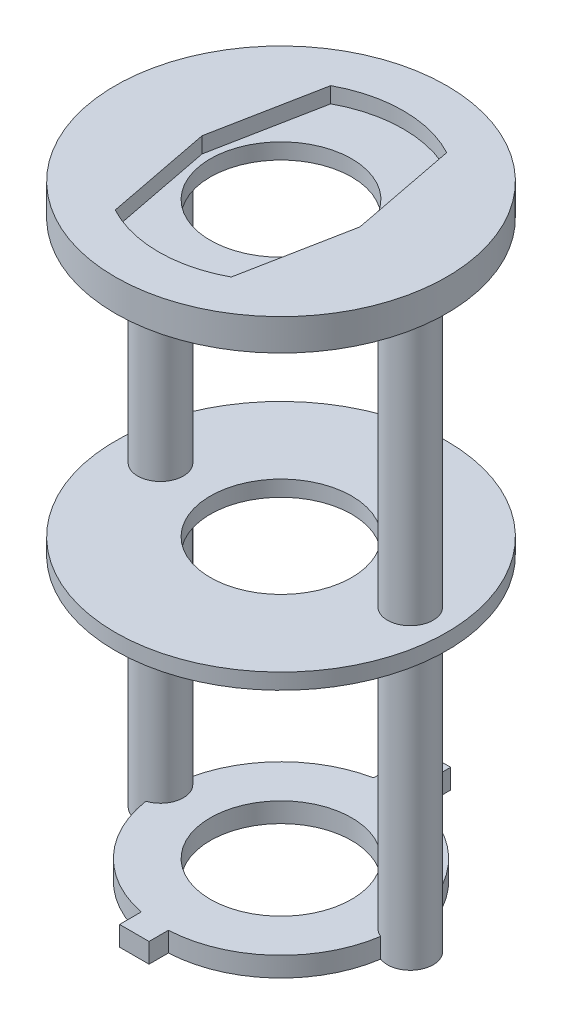
ISO-10303-21;
HEADER;
FILE_DESCRIPTION(('STEP AP214'),'2;1');
FILE_NAME('part.step','',(''),(''),'','','');
FILE_SCHEMA(('AUTOMOTIVE_DESIGN { 1 0 10303 214 1 1 1 1 }'));
ENDSEC;
DATA;
#1=APPLICATION_CONTEXT('core data for automotive mechanical design processes');
#2=APPLICATION_PROTOCOL_DEFINITION('international standard','automotive_design',2000,#1);
#3=PRODUCT_CONTEXT('',#1,'mechanical');
#4=PRODUCT('Part','Part','',(#3));
#5=PRODUCT_RELATED_PRODUCT_CATEGORY('part','',(#4));
#6=PRODUCT_DEFINITION_FORMATION('','',#4);
#7=PRODUCT_DEFINITION_CONTEXT('part definition',#1,'design');
#8=PRODUCT_DEFINITION('design','',#6,#7);
#9=PRODUCT_DEFINITION_SHAPE('','',#8);
#10=(LENGTH_UNIT() NAMED_UNIT(*) SI_UNIT(.MILLI.,.METRE.));
#11=(NAMED_UNIT(*) PLANE_ANGLE_UNIT() SI_UNIT($,.RADIAN.));
#12=(NAMED_UNIT(*) SI_UNIT($,.STERADIAN.) SOLID_ANGLE_UNIT());
#13=UNCERTAINTY_MEASURE_WITH_UNIT(LENGTH_MEASURE(1.E-05),#10,'distance_accuracy_value','');
#14=(GEOMETRIC_REPRESENTATION_CONTEXT(3) GLOBAL_UNCERTAINTY_ASSIGNED_CONTEXT((#13)) GLOBAL_UNIT_ASSIGNED_CONTEXT((#10,
#11,#12)) REPRESENTATION_CONTEXT('',''));
#15=CARTESIAN_POINT('',(0.,0.,0.));
#16=DIRECTION('',(0.,0.,1.));
#17=DIRECTION('',(1.,0.,0.));
#18=AXIS2_PLACEMENT_3D('',#15,#16,#17);
#19=CARTESIAN_POINT('',(15.9072388903172,-2.5,-0.47389161154081));
#20=DIRECTION('',(0.,1.,0.));
#21=DIRECTION('',(0.,0.,1.));
#22=AXIS2_PLACEMENT_3D('',#19,#20,#21);
#23=CYLINDRICAL_SURFACE('',#22,2.89600429274939);
#24=CARTESIAN_POINT('',(15.9072388903172,70.305,-0.47389161154081));
#25=DIRECTION('',(0.,1.,0.));
#26=DIRECTION('',(0.,0.,1.));
#27=AXIS2_PLACEMENT_3D('',#24,#25,#26);
#28=CIRCLE('',#27,2.89600429274939);
#29=CARTESIAN_POINT('',(15.9072388903172,70.305,2.42211268120858));
#30=VERTEX_POINT('',#29);
#31=EDGE_CURVE('E170',#30,#30,#28,.T.);
#32=ORIENTED_EDGE('',*,*,#31,.F.);
#33=EDGE_LOOP('',(#32));
#34=FACE_BOUND('',#33,.T.);
#35=CARTESIAN_POINT('',(15.9072388903172,35.305,-0.47389161154081));
#36=DIRECTION('',(0.,-1.,0.));
#37=DIRECTION('',(0.,0.,-1.));
#38=AXIS2_PLACEMENT_3D('',#35,#36,#37);
#39=CIRCLE('',#38,2.89600429274939);
#40=CARTESIAN_POINT('',(15.9072388903172,35.305,-3.3698959042902));
#41=VERTEX_POINT('',#40);
#42=EDGE_CURVE('E222',#41,#41,#39,.F.);
#43=ORIENTED_EDGE('',*,*,#42,.T.);
#44=EDGE_LOOP('',(#43));
#45=FACE_BOUND('',#44,.T.);
#46=ADVANCED_FACE('F33',(#34,#45),#23,.T.);
#47=CARTESIAN_POINT('',(-15.7409611318818,-2.5,-0.47389161154081));
#48=DIRECTION('',(0.,1.,0.));
#49=DIRECTION('',(0.,0.,1.));
#50=AXIS2_PLACEMENT_3D('',#47,#48,#49);
#51=CYLINDRICAL_SURFACE('',#50,2.89600429274938);
#52=CARTESIAN_POINT('',(-15.7409611318818,70.305,-0.47389161154081));
#53=DIRECTION('',(0.,1.,0.));
#54=DIRECTION('',(0.,0.,1.));
#55=AXIS2_PLACEMENT_3D('',#52,#53,#54);
#56=CIRCLE('',#55,2.89600429274938);
#57=CARTESIAN_POINT('',(-15.7409611318818,70.305,2.42211268120857));
#58=VERTEX_POINT('',#57);
#59=EDGE_CURVE('E295',#58,#58,#56,.T.);
#60=ORIENTED_EDGE('',*,*,#59,.F.);
#61=EDGE_LOOP('',(#60));
#62=FACE_BOUND('',#61,.T.);
#63=CARTESIAN_POINT('',(-15.7409611318818,35.305,-0.47389161154081));
#64=DIRECTION('',(0.,-1.,0.));
#65=DIRECTION('',(0.,0.,-1.));
#66=AXIS2_PLACEMENT_3D('',#63,#64,#65);
#67=CIRCLE('',#66,2.89600429274938);
#68=CARTESIAN_POINT('',(-15.7409611318818,35.305,-3.36989590429019));
#69=VERTEX_POINT('',#68);
#70=EDGE_CURVE('E220',#69,#69,#67,.F.);
#71=ORIENTED_EDGE('',*,*,#70,.T.);
#72=EDGE_LOOP('',(#71));
#73=FACE_BOUND('',#72,.T.);
#74=ADVANCED_FACE('F380',(#62,#73),#51,.T.);
#75=CARTESIAN_POINT('',(0.,74.305,0.));
#76=DIRECTION('',(0.,1.,0.));
#77=DIRECTION('',(0.,0.,1.));
#78=AXIS2_PLACEMENT_3D('',#75,#76,#77);
#79=PLANE('',#78);
#80=CARTESIAN_POINT('',(0.,74.305,0.));
#81=DIRECTION('',(0.,1.,0.));
#82=DIRECTION('',(0.,0.,-1.));
#83=AXIS2_PLACEMENT_3D('',#80,#81,#82);
#84=CIRCLE('',#83,15.5);
#85=CARTESIAN_POINT('',(7.35,74.305,-13.64651970284));
#86=VERTEX_POINT('',#85);
#87=CARTESIAN_POINT('',(-7.35,74.305,-13.64651970284));
#88=VERTEX_POINT('',#87);
#89=EDGE_CURVE('E49',#86,#88,#84,.T.);
#90=ORIENTED_EDGE('',*,*,#89,.F.);
#91=DIRECTION('',(-0.190580912141045,0.,-0.981671490839724));
#92=VECTOR('',#91,1.);
#93=CARTESIAN_POINT('',(10.,74.305,0.00348029716001202));
#94=LINE('',#93,#92);
#95=CARTESIAN_POINT('',(10.,74.305,0.00348029716001202));
#96=VERTEX_POINT('',#95);
#97=EDGE_CURVE('E244',#96,#86,#94,.T.);
#98=ORIENTED_EDGE('',*,*,#97,.F.);
#99=DIRECTION('',(0.190580912141045,0.,-0.981671490839724));
#100=VECTOR('',#99,1.);
#101=CARTESIAN_POINT('',(7.35,74.305,13.65348029716));
#102=LINE('',#101,#100);
#103=CARTESIAN_POINT('',(7.35,74.305,13.65348029716));
#104=VERTEX_POINT('',#103);
#105=EDGE_CURVE('E270',#104,#96,#102,.T.);
#106=ORIENTED_EDGE('',*,*,#105,.F.);
#107=CARTESIAN_POINT('',(0.,74.305,0.00696059432002231));
#108=DIRECTION('',(0.,1.,0.));
#109=DIRECTION('',(0.,0.,1.));
#110=AXIS2_PLACEMENT_3D('',#107,#108,#109);
#111=CIRCLE('',#110,15.5);
#112=CARTESIAN_POINT('',(-7.35,74.305,13.65348029716));
#113=VERTEX_POINT('',#112);
#114=EDGE_CURVE('E267',#113,#104,#111,.T.);
#115=ORIENTED_EDGE('',*,*,#114,.F.);
#116=DIRECTION('',(0.190580912141046,0.,0.981671490839724));
#117=VECTOR('',#116,1.);
#118=CARTESIAN_POINT('',(-10.,74.305,0.00348029716001289));
#119=LINE('',#118,#117);
#120=CARTESIAN_POINT('',(-10.,74.305,0.00348029716001289));
#121=VERTEX_POINT('',#120);
#122=EDGE_CURVE('E264',#121,#113,#119,.T.);
#123=ORIENTED_EDGE('',*,*,#122,.F.);
#124=DIRECTION('',(-0.190580912141046,0.,0.981671490839724));
#125=VECTOR('',#124,1.);
#126=CARTESIAN_POINT('',(-7.35,74.305,-13.64651970284));
#127=LINE('',#126,#125);
#128=EDGE_CURVE('E261',#88,#121,#127,.T.);
#129=ORIENTED_EDGE('',*,*,#128,.F.);
#130=EDGE_LOOP('',(#90,#98,#106,#115,#123,#129));
#131=FACE_BOUND('',#130,.T.);
#132=CARTESIAN_POINT('',(0.,74.305,0.));
#133=DIRECTION('',(0.,1.,0.));
#134=DIRECTION('',(0.,0.,1.));
#135=AXIS2_PLACEMENT_3D('',#132,#133,#134);
#136=CIRCLE('',#135,21.);
#137=CARTESIAN_POINT('',(0.,74.305,21.));
#138=VERTEX_POINT('',#137);
#139=EDGE_CURVE('E292',#138,#138,#136,.T.);
#140=ORIENTED_EDGE('',*,*,#139,.T.);
#141=EDGE_LOOP('',(#140));
#142=FACE_BOUND('',#141,.T.);
#143=ADVANCED_FACE('F386',(#131,#142),#79,.T.);
#144=CARTESIAN_POINT('',(0.,70.305,0.));
#145=DIRECTION('',(0.,1.,0.));
#146=DIRECTION('',(0.,0.,1.));
#147=AXIS2_PLACEMENT_3D('',#144,#145,#146);
#148=PLANE('',#147);
#149=ORIENTED_EDGE('',*,*,#31,.T.);
#150=EDGE_LOOP('',(#149));
#151=FACE_BOUND('',#150,.T.);
#152=ORIENTED_EDGE('',*,*,#59,.T.);
#153=EDGE_LOOP('',(#152));
#154=FACE_BOUND('',#153,.T.);
#155=CARTESIAN_POINT('',(0.,70.305,0.));
#156=DIRECTION('',(0.,1.,0.));
#157=DIRECTION('',(0.,0.,1.));
#158=AXIS2_PLACEMENT_3D('',#155,#156,#157);
#159=CIRCLE('',#158,21.);
#160=CARTESIAN_POINT('',(0.,70.305,21.));
#161=VERTEX_POINT('',#160);
#162=EDGE_CURVE('E291',#161,#161,#159,.T.);
#163=ORIENTED_EDGE('',*,*,#162,.F.);
#164=EDGE_LOOP('',(#163));
#165=FACE_BOUND('',#164,.T.);
#166=CARTESIAN_POINT('',(0.,70.305,0.));
#167=DIRECTION('',(0.,1.,0.));
#168=DIRECTION('',(0.,0.,1.));
#169=AXIS2_PLACEMENT_3D('',#166,#167,#168);
#170=CIRCLE('',#169,8.955);
#171=CARTESIAN_POINT('',(0.,70.305,8.955));
#172=VERTEX_POINT('',#171);
#173=EDGE_CURVE('E218',#172,#172,#170,.T.);
#174=ORIENTED_EDGE('',*,*,#173,.T.);
#175=EDGE_LOOP('',(#174));
#176=FACE_BOUND('',#175,.T.);
#177=ADVANCED_FACE('F564',(#151,#154,#165,#176),#148,.F.);
#178=CARTESIAN_POINT('',(0.,74.305,0.));
#179=DIRECTION('',(0.,-1.,0.));
#180=DIRECTION('',(0.,0.,-1.));
#181=AXIS2_PLACEMENT_3D('',#178,#179,#180);
#182=CYLINDRICAL_SURFACE('',#181,21.);
#183=ORIENTED_EDGE('',*,*,#139,.F.);
#184=EDGE_LOOP('',(#183));
#185=FACE_BOUND('',#184,.T.);
#186=ORIENTED_EDGE('',*,*,#162,.T.);
#187=EDGE_LOOP('',(#186));
#188=FACE_BOUND('',#187,.T.);
#189=ADVANCED_FACE('F575',(#185,#188),#182,.T.);
#190=CARTESIAN_POINT('',(0.,74.305,0.));
#191=DIRECTION('',(0.,-1.,0.));
#192=DIRECTION('',(0.,0.,-1.));
#193=AXIS2_PLACEMENT_3D('',#190,#191,#192);
#194=CYLINDRICAL_SURFACE('',#193,8.955);
#195=CARTESIAN_POINT('',(0.,72.305,0.));
#196=DIRECTION('',(0.,-1.,0.));
#197=DIRECTION('',(0.,0.,-1.));
#198=AXIS2_PLACEMENT_3D('',#195,#196,#197);
#199=CIRCLE('',#198,8.955);
#200=CARTESIAN_POINT('',(0.,72.305,-8.955));
#201=VERTEX_POINT('',#200);
#202=EDGE_CURVE('E216',#201,#201,#199,.T.);
#203=ORIENTED_EDGE('',*,*,#202,.F.);
#204=EDGE_LOOP('',(#203));
#205=FACE_BOUND('',#204,.T.);
#206=ORIENTED_EDGE('',*,*,#173,.F.);
#207=EDGE_LOOP('',(#206));
#208=FACE_BOUND('',#207,.T.);
#209=ADVANCED_FACE('F584',(#205,#208),#194,.F.);
#210=CARTESIAN_POINT('',(0.,72.305,0.));
#211=DIRECTION('',(0.,1.,0.));
#212=DIRECTION('',(0.,0.,1.));
#213=AXIS2_PLACEMENT_3D('',#210,#211,#212);
#214=CYLINDRICAL_SURFACE('',#213,15.5);
#215=ORIENTED_EDGE('',*,*,#89,.T.);
#216=DIRECTION('',(0.,1.,0.));
#217=VECTOR('',#216,1.);
#218=CARTESIAN_POINT('',(-7.35,72.305,-13.64651970284));
#219=LINE('',#218,#217);
#220=CARTESIAN_POINT('',(-7.35,72.305,-13.64651970284));
#221=VERTEX_POINT('',#220);
#222=EDGE_CURVE('E259',#221,#88,#219,.T.);
#223=ORIENTED_EDGE('',*,*,#222,.F.);
#224=CARTESIAN_POINT('',(0.,72.305,0.));
#225=DIRECTION('',(0.,1.,0.));
#226=DIRECTION('',(0.,0.,-1.));
#227=AXIS2_PLACEMENT_3D('',#224,#225,#226);
#228=CIRCLE('',#227,15.5);
#229=CARTESIAN_POINT('',(7.35,72.305,-13.64651970284));
#230=VERTEX_POINT('',#229);
#231=EDGE_CURVE('E240',#230,#221,#228,.T.);
#232=ORIENTED_EDGE('',*,*,#231,.F.);
#233=DIRECTION('',(0.,1.,0.));
#234=VECTOR('',#233,1.);
#235=CARTESIAN_POINT('',(7.35,72.305,-13.64651970284));
#236=LINE('',#235,#234);
#237=EDGE_CURVE('E219',#230,#86,#236,.T.);
#238=ORIENTED_EDGE('',*,*,#237,.T.);
#239=EDGE_LOOP('',(#215,#223,#232,#238));
#240=FACE_BOUND('',#239,.T.);
#241=ADVANCED_FACE('F592',(#240),#214,.F.);
#242=CARTESIAN_POINT('',(10.,72.305,0.00348029716001202));
#243=DIRECTION('',(0.981671490839724,0.,-0.190580912141045));
#244=DIRECTION('',(-0.190580912141045,0.,-0.981671490839724));
#245=AXIS2_PLACEMENT_3D('',#242,#243,#244);
#246=PLANE('',#245);
#247=ORIENTED_EDGE('',*,*,#97,.T.);
#248=ORIENTED_EDGE('',*,*,#237,.F.);
#249=DIRECTION('',(-0.190580912141045,0.,-0.981671490839724));
#250=VECTOR('',#249,1.);
#251=CARTESIAN_POINT('',(10.,72.305,0.00348029716001202));
#252=LINE('',#251,#250);
#253=CARTESIAN_POINT('',(10.,72.305,0.00348029716001202));
#254=VERTEX_POINT('',#253);
#255=EDGE_CURVE('E256',#254,#230,#252,.T.);
#256=ORIENTED_EDGE('',*,*,#255,.F.);
#257=DIRECTION('',(0.,1.,0.));
#258=VECTOR('',#257,1.);
#259=CARTESIAN_POINT('',(10.,72.305,0.00348029716001202));
#260=LINE('',#259,#258);
#261=EDGE_CURVE('E276',#254,#96,#260,.T.);
#262=ORIENTED_EDGE('',*,*,#261,.T.);
#263=EDGE_LOOP('',(#247,#248,#256,#262));
#264=FACE_BOUND('',#263,.T.);
#265=ADVANCED_FACE('F601',(#264),#246,.F.);
#266=CARTESIAN_POINT('',(7.35,72.305,13.65348029716));
#267=DIRECTION('',(0.981671490839724,0.,0.190580912141045));
#268=DIRECTION('',(0.190580912141045,0.,-0.981671490839724));
#269=AXIS2_PLACEMENT_3D('',#266,#267,#268);
#270=PLANE('',#269);
#271=ORIENTED_EDGE('',*,*,#105,.T.);
#272=ORIENTED_EDGE('',*,*,#261,.F.);
#273=DIRECTION('',(0.190580912141045,0.,-0.981671490839724));
#274=VECTOR('',#273,1.);
#275=CARTESIAN_POINT('',(7.35,72.305,13.65348029716));
#276=LINE('',#275,#274);
#277=CARTESIAN_POINT('',(7.35,72.305,13.65348029716));
#278=VERTEX_POINT('',#277);
#279=EDGE_CURVE('E253',#278,#254,#276,.T.);
#280=ORIENTED_EDGE('',*,*,#279,.F.);
#281=DIRECTION('',(0.,1.,0.));
#282=VECTOR('',#281,1.);
#283=CARTESIAN_POINT('',(7.35,72.305,13.65348029716));
#284=LINE('',#283,#282);
#285=EDGE_CURVE('E279',#278,#104,#284,.T.);
#286=ORIENTED_EDGE('',*,*,#285,.T.);
#287=EDGE_LOOP('',(#271,#272,#280,#286));
#288=FACE_BOUND('',#287,.T.);
#289=ADVANCED_FACE('F609',(#288),#270,.F.);
#290=CARTESIAN_POINT('',(0.,72.305,0.00696059432002231));
#291=DIRECTION('',(0.,1.,0.));
#292=DIRECTION('',(0.,0.,1.));
#293=AXIS2_PLACEMENT_3D('',#290,#291,#292);
#294=CYLINDRICAL_SURFACE('',#293,15.5);
#295=ORIENTED_EDGE('',*,*,#114,.T.);
#296=ORIENTED_EDGE('',*,*,#285,.F.);
#297=CARTESIAN_POINT('',(0.,72.305,0.00696059432002231));
#298=DIRECTION('',(0.,1.,0.));
#299=DIRECTION('',(0.,0.,1.));
#300=AXIS2_PLACEMENT_3D('',#297,#298,#299);
#301=CIRCLE('',#300,15.5);
#302=CARTESIAN_POINT('',(-7.35,72.305,13.65348029716));
#303=VERTEX_POINT('',#302);
#304=EDGE_CURVE('E250',#303,#278,#301,.T.);
#305=ORIENTED_EDGE('',*,*,#304,.F.);
#306=DIRECTION('',(0.,1.,0.));
#307=VECTOR('',#306,1.);
#308=CARTESIAN_POINT('',(-7.35,72.305,13.65348029716));
#309=LINE('',#308,#307);
#310=EDGE_CURVE('E282',#303,#113,#309,.T.);
#311=ORIENTED_EDGE('',*,*,#310,.T.);
#312=EDGE_LOOP('',(#295,#296,#305,#311));
#313=FACE_BOUND('',#312,.T.);
#314=ADVANCED_FACE('F618',(#313),#294,.F.);
#315=CARTESIAN_POINT('',(-10.,72.305,0.00348029716001289));
#316=DIRECTION('',(-0.981671490839724,0.,0.190580912141046));
#317=DIRECTION('',(0.190580912141046,0.,0.981671490839724));
#318=AXIS2_PLACEMENT_3D('',#315,#316,#317);
#319=PLANE('',#318);
#320=ORIENTED_EDGE('',*,*,#122,.T.);
#321=ORIENTED_EDGE('',*,*,#310,.F.);
#322=DIRECTION('',(0.190580912141046,0.,0.981671490839724));
#323=VECTOR('',#322,1.);
#324=CARTESIAN_POINT('',(-10.,72.305,0.00348029716001289));
#325=LINE('',#324,#323);
#326=CARTESIAN_POINT('',(-10.,72.305,0.00348029716001289));
#327=VERTEX_POINT('',#326);
#328=EDGE_CURVE('E247',#327,#303,#325,.T.);
#329=ORIENTED_EDGE('',*,*,#328,.F.);
#330=DIRECTION('',(0.,1.,0.));
#331=VECTOR('',#330,1.);
#332=CARTESIAN_POINT('',(-10.,72.305,0.00348029716001289));
#333=LINE('',#332,#331);
#334=EDGE_CURVE('E285',#327,#121,#333,.T.);
#335=ORIENTED_EDGE('',*,*,#334,.T.);
#336=EDGE_LOOP('',(#320,#321,#329,#335));
#337=FACE_BOUND('',#336,.T.);
#338=ADVANCED_FACE('F627',(#337),#319,.F.);
#339=CARTESIAN_POINT('',(-7.35,72.305,-13.64651970284));
#340=DIRECTION('',(-0.981671490839724,0.,-0.190580912141046));
#341=DIRECTION('',(-0.190580912141046,0.,0.981671490839724));
#342=AXIS2_PLACEMENT_3D('',#339,#340,#341);
#343=PLANE('',#342);
#344=ORIENTED_EDGE('',*,*,#128,.T.);
#345=ORIENTED_EDGE('',*,*,#334,.F.);
#346=DIRECTION('',(-0.190580912141046,0.,0.981671490839724));
#347=VECTOR('',#346,1.);
#348=CARTESIAN_POINT('',(-7.35,72.305,-13.64651970284));
#349=LINE('',#348,#347);
#350=EDGE_CURVE('E243',#221,#327,#349,.T.);
#351=ORIENTED_EDGE('',*,*,#350,.F.);
#352=ORIENTED_EDGE('',*,*,#222,.T.);
#353=EDGE_LOOP('',(#344,#345,#351,#352));
#354=FACE_BOUND('',#353,.T.);
#355=ADVANCED_FACE('F636',(#354),#343,.F.);
#356=CARTESIAN_POINT('',(0.,72.305,0.));
#357=DIRECTION('',(0.,-1.,0.));
#358=DIRECTION('',(0.,0.,-1.));
#359=AXIS2_PLACEMENT_3D('',#356,#357,#358);
#360=PLANE('',#359);
#361=ORIENTED_EDGE('',*,*,#202,.T.);
#362=EDGE_LOOP('',(#361));
#363=FACE_BOUND('',#362,.T.);
#364=ORIENTED_EDGE('',*,*,#231,.T.);
#365=ORIENTED_EDGE('',*,*,#350,.T.);
#366=ORIENTED_EDGE('',*,*,#328,.T.);
#367=ORIENTED_EDGE('',*,*,#304,.T.);
#368=ORIENTED_EDGE('',*,*,#279,.T.);
#369=ORIENTED_EDGE('',*,*,#255,.T.);
#370=EDGE_LOOP('',(#364,#365,#366,#367,#368,#369));
#371=FACE_BOUND('',#370,.T.);
#372=ADVANCED_FACE('F406',(#363,#371),#360,.F.);
#373=CARTESIAN_POINT('',(0.,33.305,0.));
#374=DIRECTION('',(0.,-1.,0.));
#375=DIRECTION('',(0.,0.,-1.));
#376=AXIS2_PLACEMENT_3D('',#373,#374,#375);
#377=PLANE('',#376);
#378=CARTESIAN_POINT('',(15.9072388903172,33.305,-0.47389161154081));
#379=DIRECTION('',(0.,-1.,0.));
#380=DIRECTION('',(0.,0.,-1.));
#381=AXIS2_PLACEMENT_3D('',#378,#379,#380);
#382=CIRCLE('',#381,2.89600429274939);
#383=CARTESIAN_POINT('',(15.9072388903172,33.305,-3.3698959042902));
#384=VERTEX_POINT('',#383);
#385=EDGE_CURVE('E11',#384,#384,#382,.F.);
#386=ORIENTED_EDGE('',*,*,#385,.T.);
#387=EDGE_LOOP('',(#386));
#388=FACE_BOUND('',#387,.T.);
#389=CARTESIAN_POINT('',(-15.7409611318818,33.305,-0.47389161154081));
#390=DIRECTION('',(0.,-1.,0.));
#391=DIRECTION('',(0.,0.,-1.));
#392=AXIS2_PLACEMENT_3D('',#389,#390,#391);
#393=CIRCLE('',#392,2.89600429274938);
#394=CARTESIAN_POINT('',(-15.7409611318818,33.305,-3.36989590429019));
#395=VERTEX_POINT('',#394);
#396=EDGE_CURVE('E37',#395,#395,#393,.F.);
#397=ORIENTED_EDGE('',*,*,#396,.T.);
#398=EDGE_LOOP('',(#397));
#399=FACE_BOUND('',#398,.T.);
#400=CARTESIAN_POINT('',(0.,33.305,0.));
#401=DIRECTION('',(0.,-1.,0.));
#402=DIRECTION('',(0.,0.,-1.));
#403=AXIS2_PLACEMENT_3D('',#400,#401,#402);
#404=CIRCLE('',#403,21.);
#405=CARTESIAN_POINT('',(0.,33.305,-21.));
#406=VERTEX_POINT('',#405);
#407=EDGE_CURVE('E223',#406,#406,#404,.T.);
#408=ORIENTED_EDGE('',*,*,#407,.T.);
#409=EDGE_LOOP('',(#408));
#410=FACE_BOUND('',#409,.T.);
#411=CARTESIAN_POINT('',(0.,33.305,0.));
#412=DIRECTION('',(0.,-1.,0.));
#413=DIRECTION('',(0.,0.,-1.));
#414=AXIS2_PLACEMENT_3D('',#411,#412,#413);
#415=CIRCLE('',#414,8.955);
#416=CARTESIAN_POINT('',(0.,33.305,-8.955));
#417=VERTEX_POINT('',#416);
#418=EDGE_CURVE('E234',#417,#417,#415,.T.);
#419=ORIENTED_EDGE('',*,*,#418,.F.);
#420=EDGE_LOOP('',(#419));
#421=FACE_BOUND('',#420,.T.);
#422=ADVANCED_FACE('F402',(#388,#399,#410,#421),#377,.T.);
#423=CARTESIAN_POINT('',(0.,35.305,0.));
#424=DIRECTION('',(0.,-1.,0.));
#425=DIRECTION('',(0.,0.,-1.));
#426=AXIS2_PLACEMENT_3D('',#423,#424,#425);
#427=PLANE('',#426);
#428=ORIENTED_EDGE('',*,*,#42,.F.);
#429=EDGE_LOOP('',(#428));
#430=FACE_BOUND('',#429,.T.);
#431=ORIENTED_EDGE('',*,*,#70,.F.);
#432=EDGE_LOOP('',(#431));
#433=FACE_BOUND('',#432,.T.);
#434=CARTESIAN_POINT('',(0.,35.305,0.));
#435=DIRECTION('',(0.,-1.,0.));
#436=DIRECTION('',(0.,0.,-1.));
#437=AXIS2_PLACEMENT_3D('',#434,#435,#436);
#438=CIRCLE('',#437,21.);
#439=CARTESIAN_POINT('',(0.,35.305,-21.));
#440=VERTEX_POINT('',#439);
#441=EDGE_CURVE('E229',#440,#440,#438,.T.);
#442=ORIENTED_EDGE('',*,*,#441,.F.);
#443=EDGE_LOOP('',(#442));
#444=FACE_BOUND('',#443,.T.);
#445=CARTESIAN_POINT('',(0.,35.305,0.));
#446=DIRECTION('',(0.,-1.,0.));
#447=DIRECTION('',(0.,0.,-1.));
#448=AXIS2_PLACEMENT_3D('',#445,#446,#447);
#449=CIRCLE('',#448,8.955);
#450=CARTESIAN_POINT('',(0.,35.305,-8.955));
#451=VERTEX_POINT('',#450);
#452=EDGE_CURVE('E237',#451,#451,#449,.T.);
#453=ORIENTED_EDGE('',*,*,#452,.T.);
#454=EDGE_LOOP('',(#453));
#455=FACE_BOUND('',#454,.T.);
#456=ADVANCED_FACE('F405',(#430,#433,#444,#455),#427,.F.);
#457=CARTESIAN_POINT('',(0.,33.305,0.));
#458=DIRECTION('',(0.,1.,0.));
#459=DIRECTION('',(0.,0.,1.));
#460=AXIS2_PLACEMENT_3D('',#457,#458,#459);
#461=CYLINDRICAL_SURFACE('',#460,21.);
#462=ORIENTED_EDGE('',*,*,#407,.F.);
#463=EDGE_LOOP('',(#462));
#464=FACE_BOUND('',#463,.T.);
#465=ORIENTED_EDGE('',*,*,#441,.T.);
#466=EDGE_LOOP('',(#465));
#467=FACE_BOUND('',#466,.T.);
#468=ADVANCED_FACE('F684',(#464,#467),#461,.T.);
#469=CARTESIAN_POINT('',(0.,33.305,0.));
#470=DIRECTION('',(0.,1.,0.));
#471=DIRECTION('',(0.,0.,1.));
#472=AXIS2_PLACEMENT_3D('',#469,#470,#471);
#473=CYLINDRICAL_SURFACE('',#472,8.955);
#474=ORIENTED_EDGE('',*,*,#418,.T.);
#475=EDGE_LOOP('',(#474));
#476=FACE_BOUND('',#475,.T.);
#477=ORIENTED_EDGE('',*,*,#452,.F.);
#478=EDGE_LOOP('',(#477));
#479=FACE_BOUND('',#478,.T.);
#480=ADVANCED_FACE('F433',(#476,#479),#473,.F.);
#481=CARTESIAN_POINT('',(-15.7409611318818,-2.5,-0.47389161154081));
#482=DIRECTION('',(0.,1.,0.));
#483=DIRECTION('',(0.,0.,1.));
#484=AXIS2_PLACEMENT_3D('',#481,#482,#483);
#485=CYLINDRICAL_SURFACE('',#484,1.715);
#486=CARTESIAN_POINT('',(-15.7409611318818,-2.5,-0.47389161154081));
#487=DIRECTION('',(0.,1.,0.));
#488=DIRECTION('',(0.,0.,1.));
#489=AXIS2_PLACEMENT_3D('',#486,#487,#488);
#490=CIRCLE('',#489,1.715);
#491=CARTESIAN_POINT('',(-15.7409611318818,-2.5,1.24110838845919));
#492=VERTEX_POINT('',#491);
#493=EDGE_CURVE('E309',#492,#492,#490,.T.);
#494=ORIENTED_EDGE('',*,*,#493,.F.);
#495=EDGE_LOOP('',(#494));
#496=FACE_BOUND('',#495,.T.);
#497=CARTESIAN_POINT('',(-15.7409611318818,12.5,-0.47389161154081));
#498=DIRECTION('',(0.,-1.,0.));
#499=DIRECTION('',(0.,0.,-1.));
#500=AXIS2_PLACEMENT_3D('',#497,#498,#499);
#501=CIRCLE('',#500,1.715);
#502=CARTESIAN_POINT('',(-15.7409611318818,12.5,-2.18889161154081));
#503=VERTEX_POINT('',#502);
#504=EDGE_CURVE('E415',#503,#503,#501,.T.);
#505=ORIENTED_EDGE('',*,*,#504,.F.);
#506=EDGE_LOOP('',(#505));
#507=FACE_BOUND('',#506,.T.);
#508=ADVANCED_FACE('F426',(#496,#507),#485,.F.);
#509=CARTESIAN_POINT('',(15.9072388903172,-2.5,-0.47389161154081));
#510=DIRECTION('',(0.,1.,0.));
#511=DIRECTION('',(0.,0.,1.));
#512=AXIS2_PLACEMENT_3D('',#509,#510,#511);
#513=CYLINDRICAL_SURFACE('',#512,1.715);
#514=CARTESIAN_POINT('',(15.9072388903172,-2.5,-0.47389161154081));
#515=DIRECTION('',(0.,1.,0.));
#516=DIRECTION('',(0.,0.,1.));
#517=AXIS2_PLACEMENT_3D('',#514,#515,#516);
#518=CIRCLE('',#517,1.715);
#519=CARTESIAN_POINT('',(15.9072388903172,-2.5,1.24110838845919));
#520=VERTEX_POINT('',#519);
#521=EDGE_CURVE('E196',#520,#520,#518,.T.);
#522=ORIENTED_EDGE('',*,*,#521,.F.);
#523=EDGE_LOOP('',(#522));
#524=FACE_BOUND('',#523,.T.);
#525=CARTESIAN_POINT('',(15.9072388903172,12.5,-0.47389161154081));
#526=DIRECTION('',(0.,-1.,0.));
#527=DIRECTION('',(0.,0.,-1.));
#528=AXIS2_PLACEMENT_3D('',#525,#526,#527);
#529=CIRCLE('',#528,1.715);
#530=CARTESIAN_POINT('',(15.9072388903172,12.5,-2.18889161154081));
#531=VERTEX_POINT('',#530);
#532=EDGE_CURVE('E419',#531,#531,#529,.T.);
#533=ORIENTED_EDGE('',*,*,#532,.F.);
#534=EDGE_LOOP('',(#533));
#535=FACE_BOUND('',#534,.T.);
#536=ADVANCED_FACE('F35',(#524,#535),#513,.F.);
#537=CARTESIAN_POINT('',(-2.99301239979817,-2.5,0.));
#538=DIRECTION('',(-1.,0.,0.));
#539=DIRECTION('',(0.,0.,1.));
#540=AXIS2_PLACEMENT_3D('',#537,#538,#539);
#541=PLANE('',#540);
#542=DIRECTION('',(0.,0.,1.));
#543=VECTOR('',#542,1.);
#544=CARTESIAN_POINT('',(-2.99301239979817,0.,0.));
#545=LINE('',#544,#543);
#546=CARTESIAN_POINT('',(-2.99301239979817,0.,-20.7597781406561));
#547=VERTEX_POINT('',#546);
#548=CARTESIAN_POINT('',(-2.99301239979817,0.,-14.7192057965634));
#549=VERTEX_POINT('',#548);
#550=EDGE_CURVE('E179',#547,#549,#545,.T.);
#551=ORIENTED_EDGE('',*,*,#550,.F.);
#552=DIRECTION('',(0.,1.,0.));
#553=VECTOR('',#552,1.);
#554=CARTESIAN_POINT('',(-2.99301239979817,-2.5,-20.7597781406561));
#555=LINE('',#554,#553);
#556=CARTESIAN_POINT('',(-2.99301239979817,-2.5,-20.7597781406561));
#557=VERTEX_POINT('',#556);
#558=EDGE_CURVE('E209',#557,#547,#555,.T.);
#559=ORIENTED_EDGE('',*,*,#558,.F.);
#560=DIRECTION('',(0.,0.,1.));
#561=VECTOR('',#560,1.);
#562=CARTESIAN_POINT('',(-2.99301239979817,-2.5,0.));
#563=LINE('',#562,#561);
#564=CARTESIAN_POINT('',(-2.99301239979817,-2.5,-14.7192057965634));
#565=VERTEX_POINT('',#564);
#566=EDGE_CURVE('E325',#557,#565,#563,.T.);
#567=ORIENTED_EDGE('',*,*,#566,.T.);
#568=DIRECTION('',(0.,1.,0.));
#569=VECTOR('',#568,1.);
#570=CARTESIAN_POINT('',(-2.99301239979817,-2.5,-14.7192057965634));
#571=LINE('',#570,#569);
#572=EDGE_CURVE('E207',#565,#549,#571,.T.);
#573=ORIENTED_EDGE('',*,*,#572,.T.);
#574=EDGE_LOOP('',(#551,#559,#567,#573));
#575=FACE_BOUND('',#574,.T.);
#576=ADVANCED_FACE('F353',(#575),#541,.T.);
#577=CARTESIAN_POINT('',(0.,-2.5,-20.7597781406561));
#578=DIRECTION('',(0.,0.,-1.));
#579=DIRECTION('',(-1.,0.,0.));
#580=AXIS2_PLACEMENT_3D('',#577,#578,#579);
#581=PLANE('',#580);
#582=DIRECTION('',(-1.,0.,0.));
#583=VECTOR('',#582,1.);
#584=CARTESIAN_POINT('',(0.,0.,-20.7597781406561));
#585=LINE('',#584,#583);
#586=CARTESIAN_POINT('',(0.735551003417867,0.,-20.7597781406561));
#587=VERTEX_POINT('',#586);
#588=EDGE_CURVE('E176',#587,#547,#585,.T.);
#589=ORIENTED_EDGE('',*,*,#588,.F.);
#590=DIRECTION('',(0.,1.,0.));
#591=VECTOR('',#590,1.);
#592=CARTESIAN_POINT('',(0.735551003417867,-2.5,-20.7597781406561));
#593=LINE('',#592,#591);
#594=CARTESIAN_POINT('',(0.735551003417867,-2.5,-20.7597781406561));
#595=VERTEX_POINT('',#594);
#596=EDGE_CURVE('E211',#595,#587,#593,.T.);
#597=ORIENTED_EDGE('',*,*,#596,.F.);
#598=DIRECTION('',(-1.,0.,0.));
#599=VECTOR('',#598,1.);
#600=CARTESIAN_POINT('',(0.,-2.5,-20.7597781406561));
#601=LINE('',#600,#599);
#602=EDGE_CURVE('E322',#595,#557,#601,.T.);
#603=ORIENTED_EDGE('',*,*,#602,.T.);
#604=ORIENTED_EDGE('',*,*,#558,.T.);
#605=EDGE_LOOP('',(#589,#597,#603,#604));
#606=FACE_BOUND('',#605,.T.);
#607=ADVANCED_FACE('F358',(#606),#581,.T.);
#608=CARTESIAN_POINT('',(0.73555100341786,-2.5,0.));
#609=DIRECTION('',(1.,0.,0.));
#610=DIRECTION('',(0.,0.,-1.));
#611=AXIS2_PLACEMENT_3D('',#608,#609,#610);
#612=PLANE('',#611);
#613=DIRECTION('',(0.,0.,-1.));
#614=VECTOR('',#613,1.);
#615=CARTESIAN_POINT('',(0.73555100341786,0.,0.));
#616=LINE('',#615,#614);
#617=CARTESIAN_POINT('',(0.735551003417865,0.,-15.0024033817353));
#618=VERTEX_POINT('',#617);
#619=EDGE_CURVE('E173',#618,#587,#616,.T.);
#620=ORIENTED_EDGE('',*,*,#619,.F.);
#621=DIRECTION('',(0.,1.,0.));
#622=VECTOR('',#621,1.);
#623=CARTESIAN_POINT('',(0.735551003417865,-2.5,-15.0024033817353));
#624=LINE('',#623,#622);
#625=CARTESIAN_POINT('',(0.735551003417865,-2.5,-15.0024033817353));
#626=VERTEX_POINT('',#625);
#627=EDGE_CURVE('E213',#626,#618,#624,.T.);
#628=ORIENTED_EDGE('',*,*,#627,.F.);
#629=DIRECTION('',(0.,0.,-1.));
#630=VECTOR('',#629,1.);
#631=CARTESIAN_POINT('',(0.73555100341786,-2.5,0.));
#632=LINE('',#631,#630);
#633=EDGE_CURVE('E319',#626,#595,#632,.T.);
#634=ORIENTED_EDGE('',*,*,#633,.T.);
#635=ORIENTED_EDGE('',*,*,#596,.T.);
#636=EDGE_LOOP('',(#620,#628,#634,#635));
#637=FACE_BOUND('',#636,.T.);
#638=ADVANCED_FACE('F361',(#637),#612,.T.);
#639=CARTESIAN_POINT('',(0.735551003417867,-2.5,0.));
#640=DIRECTION('',(1.,0.,0.));
#641=DIRECTION('',(0.,0.,-1.));
#642=AXIS2_PLACEMENT_3D('',#639,#640,#641);
#643=PLANE('',#642);
#644=DIRECTION('',(0.,0.,-1.));
#645=VECTOR('',#644,1.);
#646=CARTESIAN_POINT('',(0.735551003417867,0.,0.));
#647=LINE('',#646,#645);
#648=CARTESIAN_POINT('',(0.735551003417867,0.,17.4563933397401));
#649=VERTEX_POINT('',#648);
#650=CARTESIAN_POINT('',(0.735551003417867,0.,15.0024033817353));
#651=VERTEX_POINT('',#650);
#652=EDGE_CURVE('E142',#649,#651,#647,.T.);
#653=ORIENTED_EDGE('',*,*,#652,.F.);
#654=DIRECTION('',(0.,1.,0.));
#655=VECTOR('',#654,1.);
#656=CARTESIAN_POINT('',(0.735551003417867,-2.5,17.4563933397401));
#657=LINE('',#656,#655);
#658=CARTESIAN_POINT('',(0.735551003417867,-2.5,17.4563933397401));
#659=VERTEX_POINT('',#658);
#660=EDGE_CURVE('E136',#659,#649,#657,.T.);
#661=ORIENTED_EDGE('',*,*,#660,.F.);
#662=DIRECTION('',(0.,0.,-1.));
#663=VECTOR('',#662,1.);
#664=CARTESIAN_POINT('',(0.735551003417867,-2.5,0.));
#665=LINE('',#664,#663);
#666=CARTESIAN_POINT('',(0.735551003417867,-2.5,15.0024033817353));
#667=VERTEX_POINT('',#666);
#668=EDGE_CURVE('E139',#659,#667,#665,.T.);
#669=ORIENTED_EDGE('',*,*,#668,.T.);
#670=DIRECTION('',(0.,1.,0.));
#671=VECTOR('',#670,1.);
#672=CARTESIAN_POINT('',(0.735551003417867,-2.5,15.0024033817353));
#673=LINE('',#672,#671);
#674=EDGE_CURVE('E147',#667,#651,#673,.T.);
#675=ORIENTED_EDGE('',*,*,#674,.T.);
#676=EDGE_LOOP('',(#653,#661,#669,#675));
#677=FACE_BOUND('',#676,.T.);
#678=ADVANCED_FACE('F138',(#677),#643,.T.);
#679=CARTESIAN_POINT('',(0.,-2.5,17.4563933397401));
#680=DIRECTION('',(0.,0.,1.));
#681=DIRECTION('',(1.,0.,0.));
#682=AXIS2_PLACEMENT_3D('',#679,#680,#681);
#683=PLANE('',#682);
#684=DIRECTION('',(1.,0.,0.));
#685=VECTOR('',#684,1.);
#686=CARTESIAN_POINT('',(0.,0.,17.4563933397401));
#687=LINE('',#686,#685);
#688=CARTESIAN_POINT('',(-2.99301239979817,0.,17.4563933397401));
#689=VERTEX_POINT('',#688);
#690=EDGE_CURVE('E191',#689,#649,#687,.T.);
#691=ORIENTED_EDGE('',*,*,#690,.F.);
#692=DIRECTION('',(0.,1.,0.));
#693=VECTOR('',#692,1.);
#694=CARTESIAN_POINT('',(-2.99301239979817,-2.5,17.4563933397401));
#695=LINE('',#694,#693);
#696=CARTESIAN_POINT('',(-2.99301239979817,-2.5,17.4563933397401));
#697=VERTEX_POINT('',#696);
#698=EDGE_CURVE('E148',#697,#689,#695,.T.);
#699=ORIENTED_EDGE('',*,*,#698,.F.);
#700=DIRECTION('',(1.,0.,0.));
#701=VECTOR('',#700,1.);
#702=CARTESIAN_POINT('',(0.,-2.5,17.4563933397401));
#703=LINE('',#702,#701);
#704=EDGE_CURVE('E154',#697,#659,#703,.T.);
#705=ORIENTED_EDGE('',*,*,#704,.T.);
#706=ORIENTED_EDGE('',*,*,#660,.T.);
#707=EDGE_LOOP('',(#691,#699,#705,#706));
#708=FACE_BOUND('',#707,.T.);
#709=ADVANCED_FACE('F158',(#708),#683,.T.);
#710=CARTESIAN_POINT('',(0.,-2.5,0.));
#711=DIRECTION('',(0.,1.,0.));
#712=DIRECTION('',(0.,0.,1.));
#713=AXIS2_PLACEMENT_3D('',#710,#711,#712);
#714=CYLINDRICAL_SURFACE('',#713,8.955);
#715=CARTESIAN_POINT('',(0.,-2.5,0.));
#716=DIRECTION('',(0.,1.,0.));
#717=DIRECTION('',(0.,0.,1.));
#718=AXIS2_PLACEMENT_3D('',#715,#716,#717);
#719=CIRCLE('',#718,8.955);
#720=CARTESIAN_POINT('',(0.,-2.5,8.955));
#721=VERTEX_POINT('',#720);
#722=EDGE_CURVE('E312',#721,#721,#719,.T.);
#723=ORIENTED_EDGE('',*,*,#722,.F.);
#724=EDGE_LOOP('',(#723));
#725=FACE_BOUND('',#724,.T.);
#726=CARTESIAN_POINT('',(0.,0.,0.));
#727=DIRECTION('',(0.,1.,0.));
#728=DIRECTION('',(0.,0.,1.));
#729=AXIS2_PLACEMENT_3D('',#726,#727,#728);
#730=CIRCLE('',#729,8.955);
#731=CARTESIAN_POINT('',(0.,0.,8.955));
#732=VERTEX_POINT('',#731);
#733=EDGE_CURVE('E166',#732,#732,#730,.T.);
#734=ORIENTED_EDGE('',*,*,#733,.T.);
#735=EDGE_LOOP('',(#734));
#736=FACE_BOUND('',#735,.T.);
#737=ADVANCED_FACE('F374',(#725,#736),#714,.F.);
#738=CARTESIAN_POINT('',(-2.99301239979823,-2.5,0.));
#739=DIRECTION('',(-1.,0.,0.));
#740=DIRECTION('',(0.,0.,1.));
#741=AXIS2_PLACEMENT_3D('',#738,#739,#740);
#742=PLANE('',#741);
#743=DIRECTION('',(0.,0.,1.));
#744=VECTOR('',#743,1.);
#745=CARTESIAN_POINT('',(-2.99301239979823,0.,0.));
#746=LINE('',#745,#744);
#747=CARTESIAN_POINT('',(-2.99301239979818,0.,14.7192057965634));
#748=VERTEX_POINT('',#747);
#749=EDGE_CURVE('E188',#748,#689,#746,.T.);
#750=ORIENTED_EDGE('',*,*,#749,.F.);
#751=DIRECTION('',(0.,1.,0.));
#752=VECTOR('',#751,1.);
#753=CARTESIAN_POINT('',(-2.99301239979818,-2.5,14.7192057965634));
#754=LINE('',#753,#752);
#755=CARTESIAN_POINT('',(-2.99301239979818,-2.5,14.7192057965634));
#756=VERTEX_POINT('',#755);
#757=EDGE_CURVE('E200',#756,#748,#754,.T.);
#758=ORIENTED_EDGE('',*,*,#757,.F.);
#759=DIRECTION('',(0.,0.,1.));
#760=VECTOR('',#759,1.);
#761=CARTESIAN_POINT('',(-2.99301239979823,-2.5,0.));
#762=LINE('',#761,#760);
#763=EDGE_CURVE('E159',#756,#697,#762,.T.);
#764=ORIENTED_EDGE('',*,*,#763,.T.);
#765=ORIENTED_EDGE('',*,*,#698,.T.);
#766=EDGE_LOOP('',(#750,#758,#764,#765));
#767=FACE_BOUND('',#766,.T.);
#768=ADVANCED_FACE('F367',(#767),#742,.T.);
#769=CARTESIAN_POINT('',(0.,-2.5,0.));
#770=DIRECTION('',(0.,1.,0.));
#771=DIRECTION('',(0.,0.,1.));
#772=AXIS2_PLACEMENT_3D('',#769,#770,#771);
#773=CYLINDRICAL_SURFACE('',#772,15.0204241786619);
#774=CARTESIAN_POINT('',(0.,0.,0.));
#775=DIRECTION('',(0.,1.,0.));
#776=DIRECTION('',(0.,0.,1.));
#777=AXIS2_PLACEMENT_3D('',#774,#775,#776);
#778=CIRCLE('',#777,15.0204241786619);
#779=CARTESIAN_POINT('',(14.8548443228339,0.,2.22412739097836));
#780=VERTEX_POINT('',#779);
#781=EDGE_CURVE('E194',#651,#780,#778,.T.);
#782=ORIENTED_EDGE('',*,*,#781,.F.);
#783=ORIENTED_EDGE('',*,*,#674,.F.);
#784=CARTESIAN_POINT('',(0.,-2.5,0.));
#785=DIRECTION('',(0.,1.,0.));
#786=DIRECTION('',(0.,0.,1.));
#787=AXIS2_PLACEMENT_3D('',#784,#785,#786);
#788=CIRCLE('',#787,15.0204241786619);
#789=CARTESIAN_POINT('',(14.8548443228339,-2.5,2.22412739097836));
#790=VERTEX_POINT('',#789);
#791=EDGE_CURVE('E156',#667,#790,#788,.T.);
#792=ORIENTED_EDGE('',*,*,#791,.T.);
#793=DIRECTION('',(0.,1.,0.));
#794=VECTOR('',#793,1.);
#795=CARTESIAN_POINT('',(14.8548443228339,-2.5,2.22412739097836));
#796=LINE('',#795,#794);
#797=EDGE_CURVE('E58',#790,#780,#796,.T.);
#798=ORIENTED_EDGE('',*,*,#797,.T.);
#799=EDGE_LOOP('',(#782,#783,#792,#798));
#800=FACE_BOUND('',#799,.T.);
#801=ADVANCED_FACE('F365',(#800),#773,.T.);
#802=CARTESIAN_POINT('',(0.,-2.5,0.));
#803=DIRECTION('',(0.,1.,0.));
#804=DIRECTION('',(0.,0.,1.));
#805=AXIS2_PLACEMENT_3D('',#802,#803,#804);
#806=CYLINDRICAL_SURFACE('',#805,15.0204241786619);
#807=CARTESIAN_POINT('',(0.,0.,0.));
#808=DIRECTION('',(0.,1.,0.));
#809=DIRECTION('',(0.,0.,1.));
#810=AXIS2_PLACEMENT_3D('',#807,#808,#809);
#811=CIRCLE('',#810,15.0204241786619);
#812=CARTESIAN_POINT('',(14.6961001603967,0.,-3.10447782767391));
#813=VERTEX_POINT('',#812);
#814=EDGE_CURVE('E169',#813,#618,#811,.T.);
#815=ORIENTED_EDGE('',*,*,#814,.F.);
#816=DIRECTION('',(0.,1.,0.));
#817=VECTOR('',#816,1.);
#818=CARTESIAN_POINT('',(14.6961001603967,-2.5,-3.10447782767391));
#819=LINE('',#818,#817);
#820=CARTESIAN_POINT('',(14.6961001603967,-2.5,-3.10447782767391));
#821=VERTEX_POINT('',#820);
#822=EDGE_CURVE('E105',#821,#813,#819,.T.);
#823=ORIENTED_EDGE('',*,*,#822,.F.);
#824=CARTESIAN_POINT('',(0.,-2.5,0.));
#825=DIRECTION('',(0.,1.,0.));
#826=DIRECTION('',(0.,0.,1.));
#827=AXIS2_PLACEMENT_3D('',#824,#825,#826);
#828=CIRCLE('',#827,15.0204241786619);
#829=EDGE_CURVE('E317',#821,#626,#828,.T.);
#830=ORIENTED_EDGE('',*,*,#829,.T.);
#831=ORIENTED_EDGE('',*,*,#627,.T.);
#832=EDGE_LOOP('',(#815,#823,#830,#831));
#833=FACE_BOUND('',#832,.T.);
#834=ADVANCED_FACE('F362',(#833),#806,.T.);
#835=CARTESIAN_POINT('',(0.,-2.5,0.));
#836=DIRECTION('',(0.,1.,0.));
#837=DIRECTION('',(0.,0.,1.));
#838=AXIS2_PLACEMENT_3D('',#835,#836,#837);
#839=PLANE('',#838);
#840=ORIENTED_EDGE('',*,*,#521,.T.);
#841=EDGE_LOOP('',(#840));
#842=FACE_BOUND('',#841,.T.);
#843=ORIENTED_EDGE('',*,*,#493,.T.);
#844=EDGE_LOOP('',(#843));
#845=FACE_BOUND('',#844,.T.);
#846=ORIENTED_EDGE('',*,*,#722,.T.);
#847=EDGE_LOOP('',(#846));
#848=FACE_BOUND('',#847,.T.);
#849=CARTESIAN_POINT('',(15.9072388903172,-2.5,-0.47389161154081));
#850=DIRECTION('',(0.,1.,0.));
#851=DIRECTION('',(0.,0.,1.));
#852=AXIS2_PLACEMENT_3D('',#849,#850,#851);
#853=CIRCLE('',#852,2.89600429274939);
#854=EDGE_CURVE('E315',#790,#821,#853,.T.);
#855=ORIENTED_EDGE('',*,*,#854,.F.);
#856=ORIENTED_EDGE('',*,*,#791,.F.);
#857=ORIENTED_EDGE('',*,*,#668,.F.);
#858=ORIENTED_EDGE('',*,*,#704,.F.);
#859=ORIENTED_EDGE('',*,*,#763,.F.);
#860=CARTESIAN_POINT('',(0.,-2.5,0.));
#861=DIRECTION('',(0.,1.,0.));
#862=DIRECTION('',(0.,0.,1.));
#863=AXIS2_PLACEMENT_3D('',#860,#861,#862);
#864=CIRCLE('',#863,15.0204241786619);
#865=CARTESIAN_POINT('',(-14.8463014832498,-2.5,2.28045494921228));
#866=VERTEX_POINT('',#865);
#867=EDGE_CURVE('E161',#866,#756,#864,.T.);
#868=ORIENTED_EDGE('',*,*,#867,.F.);
#869=CARTESIAN_POINT('',(-15.7409611318818,-2.5,-0.47389161154081));
#870=DIRECTION('',(0.,1.,0.));
#871=DIRECTION('',(0.,0.,1.));
#872=AXIS2_PLACEMENT_3D('',#869,#870,#871);
#873=CIRCLE('',#872,2.89600429274938);
#874=CARTESIAN_POINT('',(-14.6822292402354,-2.5,-3.16943008190875));
#875=VERTEX_POINT('',#874);
#876=EDGE_CURVE('E331',#875,#866,#873,.T.);
#877=ORIENTED_EDGE('',*,*,#876,.F.);
#878=CARTESIAN_POINT('',(0.,-2.5,0.));
#879=DIRECTION('',(0.,1.,0.));
#880=DIRECTION('',(0.,0.,1.));
#881=AXIS2_PLACEMENT_3D('',#878,#879,#880);
#882=CIRCLE('',#881,15.0204241786619);
#883=EDGE_CURVE('E328',#565,#875,#882,.T.);
#884=ORIENTED_EDGE('',*,*,#883,.F.);
#885=ORIENTED_EDGE('',*,*,#566,.F.);
#886=ORIENTED_EDGE('',*,*,#602,.F.);
#887=ORIENTED_EDGE('',*,*,#633,.F.);
#888=ORIENTED_EDGE('',*,*,#829,.F.);
#889=EDGE_LOOP('',(#855,#856,#857,#858,#859,#868,#877,#884,#885,#886,#887,#888));
#890=FACE_BOUND('',#889,.T.);
#891=ADVANCED_FACE('F152',(#842,#845,#848,#890),#839,.F.);
#892=CARTESIAN_POINT('',(0.,-2.5,0.));
#893=DIRECTION('',(0.,1.,0.));
#894=DIRECTION('',(0.,0.,1.));
#895=AXIS2_PLACEMENT_3D('',#892,#893,#894);
#896=CYLINDRICAL_SURFACE('',#895,15.0204241786619);
#897=CARTESIAN_POINT('',(0.,0.,0.));
#898=DIRECTION('',(0.,1.,0.));
#899=DIRECTION('',(0.,0.,1.));
#900=AXIS2_PLACEMENT_3D('',#897,#898,#899);
#901=CIRCLE('',#900,15.0204241786619);
#902=CARTESIAN_POINT('',(-14.6822292402354,0.,-3.16943008190875));
#903=VERTEX_POINT('',#902);
#904=EDGE_CURVE('E182',#549,#903,#901,.T.);
#905=ORIENTED_EDGE('',*,*,#904,.F.);
#906=ORIENTED_EDGE('',*,*,#572,.F.);
#907=ORIENTED_EDGE('',*,*,#883,.T.);
#908=DIRECTION('',(0.,1.,0.));
#909=VECTOR('',#908,1.);
#910=CARTESIAN_POINT('',(-14.6822292402354,-2.5,-3.16943008190875));
#911=LINE('',#910,#909);
#912=EDGE_CURVE('E205',#875,#903,#911,.T.);
#913=ORIENTED_EDGE('',*,*,#912,.T.);
#914=EDGE_LOOP('',(#905,#906,#907,#913));
#915=FACE_BOUND('',#914,.T.);
#916=ADVANCED_FACE('F347',(#915),#896,.T.);
#917=ORIENTED_EDGE('',*,*,#385,.F.);
#918=EDGE_LOOP('',(#917));
#919=FACE_BOUND('',#918,.T.);
#920=ORIENTED_EDGE('',*,*,#822,.T.);
#921=CARTESIAN_POINT('',(15.9072388903172,0.,-0.47389161154081));
#922=DIRECTION('',(0.,1.,0.));
#923=DIRECTION('',(0.,0.,1.));
#924=AXIS2_PLACEMENT_3D('',#921,#922,#923);
#925=CIRCLE('',#924,2.89600429274939);
#926=EDGE_CURVE('E301',#813,#780,#925,.T.);
#927=ORIENTED_EDGE('',*,*,#926,.T.);
#928=ORIENTED_EDGE('',*,*,#797,.F.);
#929=ORIENTED_EDGE('',*,*,#854,.T.);
#930=EDGE_LOOP('',(#920,#927,#928,#929));
#931=FACE_BOUND('',#930,.T.);
#932=ADVANCED_FACE('F364',(#919,#931),#23,.T.);
#933=CARTESIAN_POINT('',(0.,0.,0.));
#934=DIRECTION('',(0.,1.,0.));
#935=DIRECTION('',(0.,0.,1.));
#936=AXIS2_PLACEMENT_3D('',#933,#934,#935);
#937=PLANE('',#936);
#938=ORIENTED_EDGE('',*,*,#733,.F.);
#939=EDGE_LOOP('',(#938));
#940=FACE_BOUND('',#939,.T.);
#941=ORIENTED_EDGE('',*,*,#904,.T.);
#942=CARTESIAN_POINT('',(-15.7409611318818,0.,-0.47389161154081));
#943=DIRECTION('',(0.,1.,0.));
#944=DIRECTION('',(0.,0.,1.));
#945=AXIS2_PLACEMENT_3D('',#942,#943,#944);
#946=CIRCLE('',#945,2.89600429274938);
#947=CARTESIAN_POINT('',(-14.8463014832498,0.,2.28045494921228));
#948=VERTEX_POINT('',#947);
#949=EDGE_CURVE('E298',#948,#903,#946,.T.);
#950=ORIENTED_EDGE('',*,*,#949,.F.);
#951=CARTESIAN_POINT('',(0.,0.,0.));
#952=DIRECTION('',(0.,1.,0.));
#953=DIRECTION('',(0.,0.,1.));
#954=AXIS2_PLACEMENT_3D('',#951,#952,#953);
#955=CIRCLE('',#954,15.0204241786619);
#956=EDGE_CURVE('E185',#948,#748,#955,.T.);
#957=ORIENTED_EDGE('',*,*,#956,.T.);
#958=ORIENTED_EDGE('',*,*,#749,.T.);
#959=ORIENTED_EDGE('',*,*,#690,.T.);
#960=ORIENTED_EDGE('',*,*,#652,.T.);
#961=ORIENTED_EDGE('',*,*,#781,.T.);
#962=ORIENTED_EDGE('',*,*,#926,.F.);
#963=ORIENTED_EDGE('',*,*,#814,.T.);
#964=ORIENTED_EDGE('',*,*,#619,.T.);
#965=ORIENTED_EDGE('',*,*,#588,.T.);
#966=ORIENTED_EDGE('',*,*,#550,.T.);
#967=EDGE_LOOP('',(#941,#950,#957,#958,#959,#960,#961,#962,#963,#964,#965,#966));
#968=FACE_BOUND('',#967,.T.);
#969=ADVANCED_FACE('F349',(#940,#968),#937,.T.);
#970=CARTESIAN_POINT('',(0.,-2.5,0.));
#971=DIRECTION('',(0.,1.,0.));
#972=DIRECTION('',(0.,0.,1.));
#973=AXIS2_PLACEMENT_3D('',#970,#971,#972);
#974=CYLINDRICAL_SURFACE('',#973,15.0204241786619);
#975=ORIENTED_EDGE('',*,*,#956,.F.);
#976=DIRECTION('',(0.,1.,0.));
#977=VECTOR('',#976,1.);
#978=CARTESIAN_POINT('',(-14.8463014832498,-2.5,2.28045494921228));
#979=LINE('',#978,#977);
#980=EDGE_CURVE('E202',#866,#948,#979,.T.);
#981=ORIENTED_EDGE('',*,*,#980,.F.);
#982=ORIENTED_EDGE('',*,*,#867,.T.);
#983=ORIENTED_EDGE('',*,*,#757,.T.);
#984=EDGE_LOOP('',(#975,#981,#982,#983));
#985=FACE_BOUND('',#984,.T.);
#986=ADVANCED_FACE('F337',(#985),#974,.T.);
#987=ORIENTED_EDGE('',*,*,#396,.F.);
#988=EDGE_LOOP('',(#987));
#989=FACE_BOUND('',#988,.T.);
#990=ORIENTED_EDGE('',*,*,#980,.T.);
#991=ORIENTED_EDGE('',*,*,#949,.T.);
#992=ORIENTED_EDGE('',*,*,#912,.F.);
#993=ORIENTED_EDGE('',*,*,#876,.T.);
#994=EDGE_LOOP('',(#990,#991,#992,#993));
#995=FACE_BOUND('',#994,.T.);
#996=ADVANCED_FACE('F342',(#989,#995),#51,.T.);
#997=CARTESIAN_POINT('',(-15.7409611318818,12.5,-0.47389161154081));
#998=DIRECTION('',(0.,-1.,0.));
#999=DIRECTION('',(0.,0.,-1.));
#1000=AXIS2_PLACEMENT_3D('',#997,#998,#999);
#1001=PLANE('',#1000);
#1002=ORIENTED_EDGE('',*,*,#504,.T.);
#1003=EDGE_LOOP('',(#1002));
#1004=FACE_BOUND('',#1003,.T.);
#1005=ADVANCED_FACE('F457',(#1004),#1001,.T.);
#1006=CARTESIAN_POINT('',(15.9072388903172,12.5,-0.47389161154081));
#1007=DIRECTION('',(0.,-1.,0.));
#1008=DIRECTION('',(0.,0.,-1.));
#1009=AXIS2_PLACEMENT_3D('',#1006,#1007,#1008);
#1010=PLANE('',#1009);
#1011=ORIENTED_EDGE('',*,*,#532,.T.);
#1012=EDGE_LOOP('',(#1011));
#1013=FACE_BOUND('',#1012,.T.);
#1014=ADVANCED_FACE('F423',(#1013),#1010,.T.);
#1015=CLOSED_SHELL('',(#46,#74,#143,#177,#189,#209,#241,#265,#289,#314,#338,#355,#372,#422,#456,
#468,#480,#508,#536,#576,#607,#638,#678,#709,#737,#768,#801,#834,#891,#916,#932,#969,#986,#996,
#1005,#1014));
#1016=MANIFOLD_SOLID_BREP('B2',#1015);
#1017=ADVANCED_BREP_SHAPE_REPRESENTATION('',(#18,#1016),#14);
#1018=SHAPE_DEFINITION_REPRESENTATION(#9,#1017);
ENDSEC;
END-ISO-10303-21;
